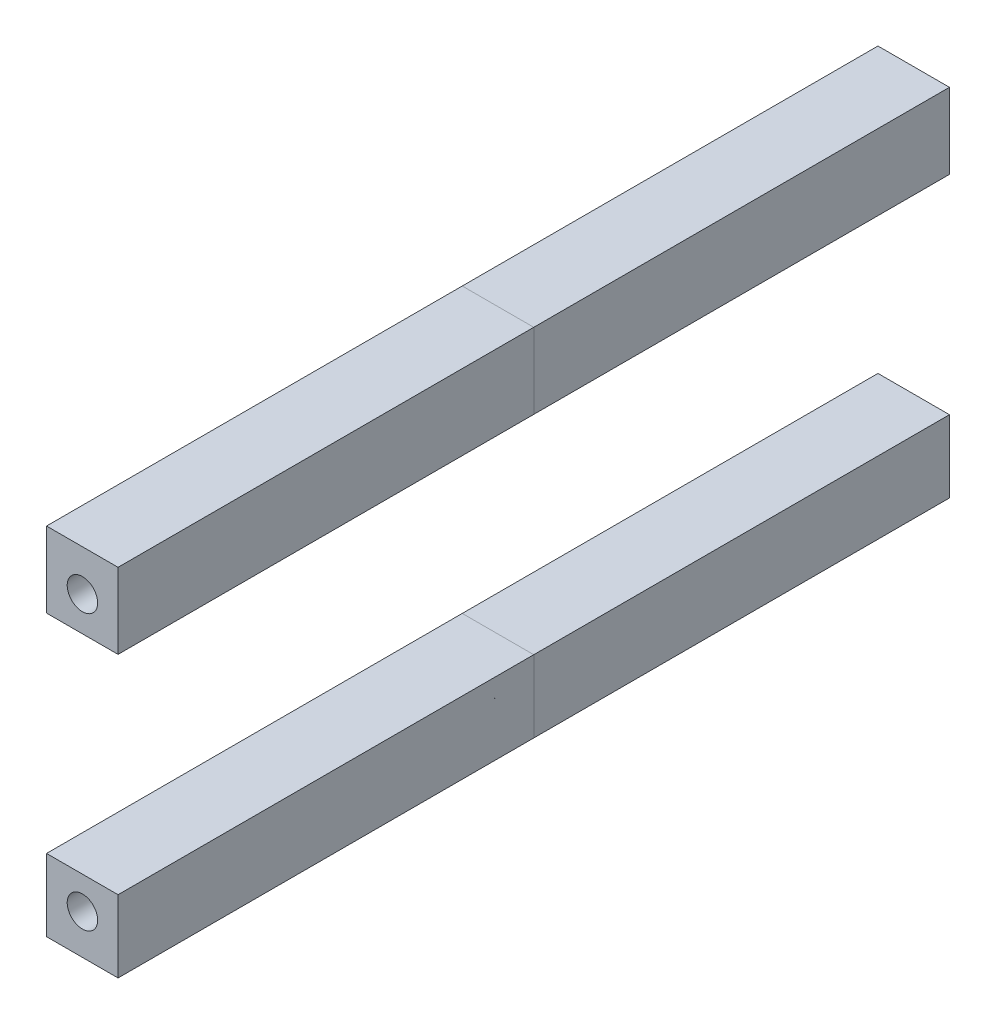
ISO-10303-21;
HEADER;
FILE_DESCRIPTION(('STEP AP214'),'2;1');
FILE_NAME('part.step','',(''),(''),'','','');
FILE_SCHEMA(('AUTOMOTIVE_DESIGN { 1 0 10303 214 1 1 1 1 }'));
ENDSEC;
DATA;
#1=APPLICATION_CONTEXT('core data for automotive mechanical design processes');
#2=APPLICATION_PROTOCOL_DEFINITION('international standard','automotive_design',2000,#1);
#3=PRODUCT_CONTEXT('',#1,'mechanical');
#4=PRODUCT('Part','Part','',(#3));
#5=PRODUCT_RELATED_PRODUCT_CATEGORY('part','',(#4));
#6=PRODUCT_DEFINITION_FORMATION('','',#4);
#7=PRODUCT_DEFINITION_CONTEXT('part definition',#1,'design');
#8=PRODUCT_DEFINITION('design','',#6,#7);
#9=PRODUCT_DEFINITION_SHAPE('','',#8);
#10=(LENGTH_UNIT() NAMED_UNIT(*) SI_UNIT(.MILLI.,.METRE.));
#11=(NAMED_UNIT(*) PLANE_ANGLE_UNIT() SI_UNIT($,.RADIAN.));
#12=(NAMED_UNIT(*) SI_UNIT($,.STERADIAN.) SOLID_ANGLE_UNIT());
#13=UNCERTAINTY_MEASURE_WITH_UNIT(LENGTH_MEASURE(1.E-05),#10,'distance_accuracy_value','');
#14=(GEOMETRIC_REPRESENTATION_CONTEXT(3) GLOBAL_UNCERTAINTY_ASSIGNED_CONTEXT((#13)) GLOBAL_UNIT_ASSIGNED_CONTEXT((#10,
#11,#12)) REPRESENTATION_CONTEXT('',''));
#15=CARTESIAN_POINT('',(0.,0.,0.));
#16=DIRECTION('',(0.,0.,1.));
#17=DIRECTION('',(1.,0.,0.));
#18=AXIS2_PLACEMENT_3D('',#15,#16,#17);
#19=CARTESIAN_POINT('',(26.6682742565804,-13.334,-110.236));
#20=DIRECTION('',(0.,1.,0.));
#21=DIRECTION('',(0.,0.,-1.));
#22=AXIS2_PLACEMENT_3D('',#19,#20,#21);
#23=PLANE('',#22);
#24=DIRECTION('',(0.,0.,1.));
#25=VECTOR('',#24,1.);
#26=CARTESIAN_POINT('',(39.9346416559342,-13.334,-157.988));
#27=LINE('',#26,#25);
#28=CARTESIAN_POINT('',(39.9346416559342,-13.334,-122.936));
#29=VERTEX_POINT('',#28);
#30=CARTESIAN_POINT('',(39.9346416559342,-13.334,-61.468));
#31=VERTEX_POINT('',#30);
#32=EDGE_CURVE('E52',#29,#31,#27,.T.);
#33=ORIENTED_EDGE('',*,*,#32,.F.);
#34=DIRECTION('',(-1.,0.,0.));
#35=VECTOR('',#34,1.);
#36=CARTESIAN_POINT('',(26.6682742565804,-13.334,-122.936));
#37=LINE('',#36,#35);
#38=CARTESIAN_POINT('',(29.3613265236635,-13.334,-122.936));
#39=VERTEX_POINT('',#38);
#40=EDGE_CURVE('E109',#29,#39,#37,.T.);
#41=ORIENTED_EDGE('',*,*,#40,.T.);
#42=DIRECTION('',(0.,0.,1.));
#43=VECTOR('',#42,1.);
#44=CARTESIAN_POINT('',(29.3613265236635,-13.334,-122.936));
#45=LINE('',#44,#43);
#46=CARTESIAN_POINT('',(29.3613265236635,-13.334,-61.468));
#47=VERTEX_POINT('',#46);
#48=EDGE_CURVE('E102',#39,#47,#45,.T.);
#49=ORIENTED_EDGE('',*,*,#48,.T.);
#50=DIRECTION('',(1.,0.,0.));
#51=VECTOR('',#50,1.);
#52=CARTESIAN_POINT('',(39.9346416559342,-13.334,-61.468));
#53=LINE('',#52,#51);
#54=EDGE_CURVE('E91',#47,#31,#53,.T.);
#55=ORIENTED_EDGE('',*,*,#54,.T.);
#56=EDGE_LOOP('',(#33,#41,#49,#55));
#57=FACE_BOUND('',#56,.T.);
#58=ADVANCED_FACE('F48',(#57),#23,.T.);
#59=CARTESIAN_POINT('',(0.,0.,-122.936));
#60=DIRECTION('',(0.,0.,-1.));
#61=DIRECTION('',(1.,0.,0.));
#62=AXIS2_PLACEMENT_3D('',#59,#60,#61);
#63=PLANE('',#62);
#64=DIRECTION('',(0.,-1.,0.));
#65=VECTOR('',#64,1.);
#66=CARTESIAN_POINT('',(39.9346416559342,0.,-122.936));
#67=LINE('',#66,#65);
#68=CARTESIAN_POINT('',(39.9346416559342,-24.4883017461568,-122.936));
#69=VERTEX_POINT('',#68);
#70=EDGE_CURVE('E103',#29,#69,#67,.T.);
#71=ORIENTED_EDGE('',*,*,#70,.T.);
#72=DIRECTION('',(-1.,0.,0.));
#73=VECTOR('',#72,1.);
#74=CARTESIAN_POINT('',(0.,-24.4883017461568,-122.936));
#75=LINE('',#74,#73);
#76=CARTESIAN_POINT('',(29.3613265236635,-24.4883017461568,-122.936));
#77=VERTEX_POINT('',#76);
#78=EDGE_CURVE('E58',#69,#77,#75,.T.);
#79=ORIENTED_EDGE('',*,*,#78,.T.);
#80=DIRECTION('',(0.,1.,0.));
#81=VECTOR('',#80,1.);
#82=CARTESIAN_POINT('',(29.3613265236635,0.,-122.936));
#83=LINE('',#82,#81);
#84=EDGE_CURVE('E12',#77,#39,#83,.T.);
#85=ORIENTED_EDGE('',*,*,#84,.T.);
#86=ORIENTED_EDGE('',*,*,#40,.F.);
#87=EDGE_LOOP('',(#71,#79,#85,#86));
#88=FACE_BOUND('',#87,.T.);
#89=CARTESIAN_POINT('',(34.6682742565804,-19.4034898588683,-122.936));
#90=DIRECTION('',(0.,0.,1.));
#91=DIRECTION('',(1.,0.,0.));
#92=AXIS2_PLACEMENT_3D('',#89,#90,#91);
#93=CIRCLE('',#92,2.24999999999999);
#94=CARTESIAN_POINT('',(36.9182742565804,-19.4034898588683,-122.936));
#95=VERTEX_POINT('',#94);
#96=EDGE_CURVE('E110',#95,#95,#93,.T.);
#97=ORIENTED_EDGE('',*,*,#96,.T.);
#98=EDGE_LOOP('',(#97));
#99=FACE_BOUND('',#98,.T.);
#100=ADVANCED_FACE('F50',(#88,#99),#63,.T.);
#101=CARTESIAN_POINT('',(34.6682742565804,-19.4034898588683,-110.236));
#102=DIRECTION('',(0.,0.,-1.));
#103=DIRECTION('',(1.,0.,0.));
#104=AXIS2_PLACEMENT_3D('',#101,#102,#103);
#105=CYLINDRICAL_SURFACE('',#104,2.24999999999999);
#106=ORIENTED_EDGE('',*,*,#96,.F.);
#107=EDGE_LOOP('',(#106));
#108=FACE_BOUND('',#107,.T.);
#109=CARTESIAN_POINT('',(34.6682742565804,-19.4034898588683,-61.468));
#110=DIRECTION('',(0.,0.,-1.));
#111=DIRECTION('',(-1.,0.,0.));
#112=AXIS2_PLACEMENT_3D('',#109,#110,#111);
#113=CIRCLE('',#112,2.24999999999999);
#114=CARTESIAN_POINT('',(32.4182742565804,-19.4034898588683,-61.468));
#115=VERTEX_POINT('',#114);
#116=EDGE_CURVE('E113',#115,#115,#113,.T.);
#117=ORIENTED_EDGE('',*,*,#116,.F.);
#118=EDGE_LOOP('',(#117));
#119=FACE_BOUND('',#118,.T.);
#120=ADVANCED_FACE('F126',(#108,#119),#105,.F.);
#121=CARTESIAN_POINT('',(39.9346416559342,-13.334,-122.936));
#122=DIRECTION('',(1.,0.,0.));
#123=DIRECTION('',(0.,0.,1.));
#124=AXIS2_PLACEMENT_3D('',#121,#122,#123);
#125=PLANE('',#124);
#126=DIRECTION('',(0.,-1.,0.));
#127=VECTOR('',#126,1.);
#128=CARTESIAN_POINT('',(39.9346416559342,-13.334,-61.468));
#129=LINE('',#128,#127);
#130=CARTESIAN_POINT('',(39.9346416559342,-24.4883017461568,-61.468));
#131=VERTEX_POINT('',#130);
#132=EDGE_CURVE('E86',#31,#131,#129,.T.);
#133=ORIENTED_EDGE('',*,*,#132,.T.);
#134=DIRECTION('',(0.,0.,1.));
#135=VECTOR('',#134,1.);
#136=CARTESIAN_POINT('',(39.9346416559342,-24.4883017461568,-122.936));
#137=LINE('',#136,#135);
#138=EDGE_CURVE('E117',#69,#131,#137,.T.);
#139=ORIENTED_EDGE('',*,*,#138,.F.);
#140=ORIENTED_EDGE('',*,*,#70,.F.);
#141=ORIENTED_EDGE('',*,*,#32,.T.);
#142=EDGE_LOOP('',(#133,#139,#140,#141));
#143=FACE_BOUND('',#142,.T.);
#144=ADVANCED_FACE('F107',(#143),#125,.T.);
#145=CARTESIAN_POINT('',(29.3613265236635,-13.334,-122.936));
#146=DIRECTION('',(-1.,0.,0.));
#147=DIRECTION('',(0.,0.,-1.));
#148=AXIS2_PLACEMENT_3D('',#145,#146,#147);
#149=PLANE('',#148);
#150=DIRECTION('',(0.,0.,1.));
#151=VECTOR('',#150,1.);
#152=CARTESIAN_POINT('',(29.3613265236635,-24.4883017461568,-122.936));
#153=LINE('',#152,#151);
#154=CARTESIAN_POINT('',(29.3613265236635,-24.4883017461568,-61.468));
#155=VERTEX_POINT('',#154);
#156=EDGE_CURVE('E97',#77,#155,#153,.T.);
#157=ORIENTED_EDGE('',*,*,#156,.T.);
#158=DIRECTION('',(0.,1.,0.));
#159=VECTOR('',#158,1.);
#160=CARTESIAN_POINT('',(29.3613265236635,-13.334,-61.468));
#161=LINE('',#160,#159);
#162=EDGE_CURVE('E104',#155,#47,#161,.T.);
#163=ORIENTED_EDGE('',*,*,#162,.T.);
#164=ORIENTED_EDGE('',*,*,#48,.F.);
#165=ORIENTED_EDGE('',*,*,#84,.F.);
#166=EDGE_LOOP('',(#157,#163,#164,#165));
#167=FACE_BOUND('',#166,.T.);
#168=ADVANCED_FACE('F134',(#167),#149,.T.);
#169=CARTESIAN_POINT('',(39.9346416559342,-24.4883017461568,-122.936));
#170=DIRECTION('',(0.,-1.,0.));
#171=DIRECTION('',(0.,0.,1.));
#172=AXIS2_PLACEMENT_3D('',#169,#170,#171);
#173=PLANE('',#172);
#174=ORIENTED_EDGE('',*,*,#138,.T.);
#175=DIRECTION('',(-1.,0.,0.));
#176=VECTOR('',#175,1.);
#177=CARTESIAN_POINT('',(39.9346416559342,-24.4883017461568,-61.468));
#178=LINE('',#177,#176);
#179=EDGE_CURVE('E93',#131,#155,#178,.T.);
#180=ORIENTED_EDGE('',*,*,#179,.T.);
#181=ORIENTED_EDGE('',*,*,#156,.F.);
#182=ORIENTED_EDGE('',*,*,#78,.F.);
#183=EDGE_LOOP('',(#174,#180,#181,#182));
#184=FACE_BOUND('',#183,.T.);
#185=ADVANCED_FACE('F167',(#184),#173,.T.);
#186=CARTESIAN_POINT('',(0.,0.,-61.468));
#187=DIRECTION('',(0.,0.,1.));
#188=DIRECTION('',(-1.,0.,0.));
#189=AXIS2_PLACEMENT_3D('',#186,#187,#188);
#190=PLANE('',#189);
#191=ORIENTED_EDGE('',*,*,#132,.F.);
#192=ORIENTED_EDGE('',*,*,#54,.F.);
#193=ORIENTED_EDGE('',*,*,#162,.F.);
#194=ORIENTED_EDGE('',*,*,#179,.F.);
#195=EDGE_LOOP('',(#191,#192,#193,#194));
#196=FACE_BOUND('',#195,.T.);
#197=ORIENTED_EDGE('',*,*,#116,.T.);
#198=EDGE_LOOP('',(#197));
#199=FACE_BOUND('',#198,.T.);
#200=ADVANCED_FACE('F88',(#196,#199),#190,.T.);
#201=CLOSED_SHELL('',(#58,#100,#120,#144,#168,#185,#200));
#202=MANIFOLD_SOLID_BREP('B2',#201);
#203=CARTESIAN_POINT('',(0.,0.,-61.468));
#204=DIRECTION('',(0.,0.,-1.));
#205=DIRECTION('',(1.,0.,0.));
#206=AXIS2_PLACEMENT_3D('',#203,#204,#205);
#207=PLANE('',#206);
#208=DIRECTION('',(0.,-1.,0.));
#209=VECTOR('',#208,1.);
#210=CARTESIAN_POINT('',(39.9346416559342,-65.926275723454,-61.468));
#211=LINE('',#210,#209);
#212=CARTESIAN_POINT('',(39.9346416559342,-55.2598376185571,-61.468));
#213=VERTEX_POINT('',#212);
#214=CARTESIAN_POINT('',(39.9346416559342,-65.926275723454,-61.468));
#215=VERTEX_POINT('',#214);
#216=EDGE_CURVE('E272',#213,#215,#211,.T.);
#217=ORIENTED_EDGE('',*,*,#216,.F.);
#218=DIRECTION('',(1.,0.,0.));
#219=VECTOR('',#218,1.);
#220=CARTESIAN_POINT('',(39.9346416559342,-55.2598376185571,-61.468));
#221=LINE('',#220,#219);
#222=CARTESIAN_POINT('',(29.3613265236635,-55.2598376185571,-61.468));
#223=VERTEX_POINT('',#222);
#224=EDGE_CURVE('E273',#223,#213,#221,.T.);
#225=ORIENTED_EDGE('',*,*,#224,.F.);
#226=DIRECTION('',(0.,1.,0.));
#227=VECTOR('',#226,1.);
#228=CARTESIAN_POINT('',(29.3613265236635,-65.926275723454,-61.468));
#229=LINE('',#228,#227);
#230=CARTESIAN_POINT('',(29.3613265236635,-65.926275723454,-61.468));
#231=VERTEX_POINT('',#230);
#232=EDGE_CURVE('E277',#231,#223,#229,.T.);
#233=ORIENTED_EDGE('',*,*,#232,.F.);
#234=DIRECTION('',(-1.,0.,0.));
#235=VECTOR('',#234,1.);
#236=CARTESIAN_POINT('',(39.9346416559342,-65.926275723454,-61.468));
#237=LINE('',#236,#235);
#238=EDGE_CURVE('E292',#215,#231,#237,.T.);
#239=ORIENTED_EDGE('',*,*,#238,.F.);
#240=EDGE_LOOP('',(#217,#225,#233,#239));
#241=FACE_BOUND('',#240,.T.);
#242=CARTESIAN_POINT('',(34.6682742565804,-60.0434898588683,-61.468));
#243=DIRECTION('',(0.,0.,-1.));
#244=DIRECTION('',(-1.,0.,0.));
#245=AXIS2_PLACEMENT_3D('',#242,#243,#244);
#246=CIRCLE('',#245,2.24999999999999);
#247=CARTESIAN_POINT('',(32.4182742565804,-60.0434898588683,-61.468));
#248=VERTEX_POINT('',#247);
#249=EDGE_CURVE('E295',#248,#248,#246,.T.);
#250=ORIENTED_EDGE('',*,*,#249,.T.);
#251=EDGE_LOOP('',(#250));
#252=FACE_BOUND('',#251,.T.);
#253=ADVANCED_FACE('F218',(#241,#252),#207,.F.);
#254=CARTESIAN_POINT('',(39.9346416559342,-65.926275723454,-122.936));
#255=DIRECTION('',(0.,-1.,0.));
#256=DIRECTION('',(0.,0.,1.));
#257=AXIS2_PLACEMENT_3D('',#254,#255,#256);
#258=PLANE('',#257);
#259=DIRECTION('',(0.,0.,1.));
#260=VECTOR('',#259,1.);
#261=CARTESIAN_POINT('',(39.9346416559342,-65.926275723454,-122.936));
#262=LINE('',#261,#260);
#263=CARTESIAN_POINT('',(39.9346416559342,-65.926275723454,-122.936));
#264=VERTEX_POINT('',#263);
#265=EDGE_CURVE('E266',#264,#215,#262,.T.);
#266=ORIENTED_EDGE('',*,*,#265,.T.);
#267=ORIENTED_EDGE('',*,*,#238,.T.);
#268=DIRECTION('',(0.,0.,1.));
#269=VECTOR('',#268,1.);
#270=CARTESIAN_POINT('',(29.3613265236635,-65.926275723454,-122.936));
#271=LINE('',#270,#269);
#272=CARTESIAN_POINT('',(29.3613265236635,-65.926275723454,-122.936));
#273=VERTEX_POINT('',#272);
#274=EDGE_CURVE('E268',#273,#231,#271,.T.);
#275=ORIENTED_EDGE('',*,*,#274,.F.);
#276=DIRECTION('',(1.,0.,0.));
#277=VECTOR('',#276,1.);
#278=CARTESIAN_POINT('',(0.,-65.926275723454,-122.936));
#279=LINE('',#278,#277);
#280=EDGE_CURVE('E259',#273,#264,#279,.T.);
#281=ORIENTED_EDGE('',*,*,#280,.T.);
#282=EDGE_LOOP('',(#266,#267,#275,#281));
#283=FACE_BOUND('',#282,.T.);
#284=ADVANCED_FACE('F264',(#283),#258,.T.);
#285=CARTESIAN_POINT('',(29.3613265236635,-65.926275723454,-122.936));
#286=DIRECTION('',(-1.,0.,0.));
#287=DIRECTION('',(0.,0.,-1.));
#288=AXIS2_PLACEMENT_3D('',#285,#286,#287);
#289=PLANE('',#288);
#290=ORIENTED_EDGE('',*,*,#274,.T.);
#291=ORIENTED_EDGE('',*,*,#232,.T.);
#292=DIRECTION('',(0.,0.,1.));
#293=VECTOR('',#292,1.);
#294=CARTESIAN_POINT('',(29.3613265236635,-55.2598376185571,-122.936));
#295=LINE('',#294,#293);
#296=CARTESIAN_POINT('',(29.3613265236635,-55.2598376185571,-122.936));
#297=VERTEX_POINT('',#296);
#298=EDGE_CURVE('E275',#297,#223,#295,.T.);
#299=ORIENTED_EDGE('',*,*,#298,.F.);
#300=DIRECTION('',(0.,-1.,0.));
#301=VECTOR('',#300,1.);
#302=CARTESIAN_POINT('',(29.3613265236635,0.,-122.936));
#303=LINE('',#302,#301);
#304=EDGE_CURVE('E226',#297,#273,#303,.T.);
#305=ORIENTED_EDGE('',*,*,#304,.T.);
#306=EDGE_LOOP('',(#290,#291,#299,#305));
#307=FACE_BOUND('',#306,.T.);
#308=ADVANCED_FACE('F284',(#307),#289,.T.);
#309=CARTESIAN_POINT('',(39.9346416559342,-55.2598376185571,-122.936));
#310=DIRECTION('',(0.,1.,0.));
#311=DIRECTION('',(0.,0.,-1.));
#312=AXIS2_PLACEMENT_3D('',#309,#310,#311);
#313=PLANE('',#312);
#314=ORIENTED_EDGE('',*,*,#298,.T.);
#315=ORIENTED_EDGE('',*,*,#224,.T.);
#316=DIRECTION('',(0.,0.,1.));
#317=VECTOR('',#316,1.);
#318=CARTESIAN_POINT('',(39.9346416559342,-55.2598376185571,-122.936));
#319=LINE('',#318,#317);
#320=CARTESIAN_POINT('',(39.9346416559342,-55.2598376185571,-122.936));
#321=VERTEX_POINT('',#320);
#322=EDGE_CURVE('E238',#321,#213,#319,.T.);
#323=ORIENTED_EDGE('',*,*,#322,.F.);
#324=DIRECTION('',(-1.,0.,0.));
#325=VECTOR('',#324,1.);
#326=CARTESIAN_POINT('',(0.,-55.2598376185571,-122.936));
#327=LINE('',#326,#325);
#328=EDGE_CURVE('E46',#321,#297,#327,.T.);
#329=ORIENTED_EDGE('',*,*,#328,.T.);
#330=EDGE_LOOP('',(#314,#315,#323,#329));
#331=FACE_BOUND('',#330,.T.);
#332=ADVANCED_FACE('F308',(#331),#313,.T.);
#333=CARTESIAN_POINT('',(39.9346416559342,-65.926275723454,-122.936));
#334=DIRECTION('',(1.,0.,0.));
#335=DIRECTION('',(0.,0.,1.));
#336=AXIS2_PLACEMENT_3D('',#333,#334,#335);
#337=PLANE('',#336);
#338=ORIENTED_EDGE('',*,*,#322,.T.);
#339=ORIENTED_EDGE('',*,*,#216,.T.);
#340=ORIENTED_EDGE('',*,*,#265,.F.);
#341=DIRECTION('',(0.,1.,0.));
#342=VECTOR('',#341,1.);
#343=CARTESIAN_POINT('',(39.9346416559342,0.,-122.936));
#344=LINE('',#343,#342);
#345=EDGE_CURVE('E233',#264,#321,#344,.T.);
#346=ORIENTED_EDGE('',*,*,#345,.T.);
#347=EDGE_LOOP('',(#338,#339,#340,#346));
#348=FACE_BOUND('',#347,.T.);
#349=ADVANCED_FACE('F270',(#348),#337,.T.);
#350=CARTESIAN_POINT('',(34.6682742565804,-60.0434898588683,-110.236));
#351=DIRECTION('',(0.,0.,-1.));
#352=DIRECTION('',(1.,0.,0.));
#353=AXIS2_PLACEMENT_3D('',#350,#351,#352);
#354=CYLINDRICAL_SURFACE('',#353,2.24999999999999);
#355=CARTESIAN_POINT('',(34.6682742565804,-60.0434898588683,-122.936));
#356=DIRECTION('',(0.,0.,1.));
#357=DIRECTION('',(1.,0.,0.));
#358=AXIS2_PLACEMENT_3D('',#355,#356,#357);
#359=CIRCLE('',#358,2.24999999999999);
#360=CARTESIAN_POINT('',(36.9182742565804,-60.0434898588683,-122.936));
#361=VERTEX_POINT('',#360);
#362=EDGE_CURVE('E261',#361,#361,#359,.T.);
#363=ORIENTED_EDGE('',*,*,#362,.F.);
#364=EDGE_LOOP('',(#363));
#365=FACE_BOUND('',#364,.T.);
#366=ORIENTED_EDGE('',*,*,#249,.F.);
#367=EDGE_LOOP('',(#366));
#368=FACE_BOUND('',#367,.T.);
#369=ADVANCED_FACE('F300',(#365,#368),#354,.F.);
#370=CARTESIAN_POINT('',(0.,0.,-122.936));
#371=DIRECTION('',(0.,0.,-1.));
#372=DIRECTION('',(1.,0.,0.));
#373=AXIS2_PLACEMENT_3D('',#370,#371,#372);
#374=PLANE('',#373);
#375=ORIENTED_EDGE('',*,*,#362,.T.);
#376=EDGE_LOOP('',(#375));
#377=FACE_BOUND('',#376,.T.);
#378=ORIENTED_EDGE('',*,*,#345,.F.);
#379=ORIENTED_EDGE('',*,*,#280,.F.);
#380=ORIENTED_EDGE('',*,*,#304,.F.);
#381=ORIENTED_EDGE('',*,*,#328,.F.);
#382=EDGE_LOOP('',(#378,#379,#380,#381));
#383=FACE_BOUND('',#382,.T.);
#384=ADVANCED_FACE('F220',(#377,#383),#374,.T.);
#385=CLOSED_SHELL('',(#253,#284,#308,#332,#349,#369,#384));
#386=MANIFOLD_SOLID_BREP('B6',#385);
#387=CARTESIAN_POINT('',(26.6682742565804,-13.334,-12.7));
#388=DIRECTION('',(0.,1.,0.));
#389=DIRECTION('',(0.,0.,1.));
#390=AXIS2_PLACEMENT_3D('',#387,#388,#389);
#391=PLANE('',#390);
#392=DIRECTION('',(0.,0.,-1.));
#393=VECTOR('',#392,1.);
#394=CARTESIAN_POINT('',(39.9346416559342,-13.334,35.052));
#395=LINE('',#394,#393);
#396=CARTESIAN_POINT('',(39.9346416559342,-13.334,0.));
#397=VERTEX_POINT('',#396);
#398=CARTESIAN_POINT('',(39.9346416559342,-13.334,-61.468));
#399=VERTEX_POINT('',#398);
#400=EDGE_CURVE('E391',#397,#399,#395,.T.);
#401=ORIENTED_EDGE('',*,*,#400,.T.);
#402=DIRECTION('',(1.,0.,0.));
#403=VECTOR('',#402,1.);
#404=CARTESIAN_POINT('',(39.9346416559342,-13.334,-61.468));
#405=LINE('',#404,#403);
#406=CARTESIAN_POINT('',(29.3613265236635,-13.334,-61.468));
#407=VERTEX_POINT('',#406);
#408=EDGE_CURVE('E424',#407,#399,#405,.T.);
#409=ORIENTED_EDGE('',*,*,#408,.F.);
#410=DIRECTION('',(0.,0.,-1.));
#411=VECTOR('',#410,1.);
#412=CARTESIAN_POINT('',(29.3613265236635,-13.334,0.));
#413=LINE('',#412,#411);
#414=CARTESIAN_POINT('',(29.3613265236635,-13.334,0.));
#415=VERTEX_POINT('',#414);
#416=EDGE_CURVE('E405',#415,#407,#413,.T.);
#417=ORIENTED_EDGE('',*,*,#416,.F.);
#418=DIRECTION('',(-1.,0.,0.));
#419=VECTOR('',#418,1.);
#420=CARTESIAN_POINT('',(26.6682742565804,-13.334,0.));
#421=LINE('',#420,#419);
#422=EDGE_CURVE('E426',#397,#415,#421,.T.);
#423=ORIENTED_EDGE('',*,*,#422,.F.);
#424=EDGE_LOOP('',(#401,#409,#417,#423));
#425=FACE_BOUND('',#424,.T.);
#426=ADVANCED_FACE('F387',(#425),#391,.T.);
#427=CARTESIAN_POINT('',(0.,0.,0.));
#428=DIRECTION('',(0.,0.,1.));
#429=DIRECTION('',(1.,0.,0.));
#430=AXIS2_PLACEMENT_3D('',#427,#428,#429);
#431=PLANE('',#430);
#432=DIRECTION('',(0.,-1.,0.));
#433=VECTOR('',#432,1.);
#434=CARTESIAN_POINT('',(39.9346416559342,0.,0.));
#435=LINE('',#434,#433);
#436=CARTESIAN_POINT('',(39.9346416559342,-24.4883017461568,0.));
#437=VERTEX_POINT('',#436);
#438=EDGE_CURVE('E440',#397,#437,#435,.T.);
#439=ORIENTED_EDGE('',*,*,#438,.F.);
#440=ORIENTED_EDGE('',*,*,#422,.T.);
#441=DIRECTION('',(0.,1.,0.));
#442=VECTOR('',#441,1.);
#443=CARTESIAN_POINT('',(29.3613265236635,0.,0.));
#444=LINE('',#443,#442);
#445=CARTESIAN_POINT('',(29.3613265236635,-24.4883017461568,0.));
#446=VERTEX_POINT('',#445);
#447=EDGE_CURVE('E216',#446,#415,#444,.T.);
#448=ORIENTED_EDGE('',*,*,#447,.F.);
#449=DIRECTION('',(-1.,0.,0.));
#450=VECTOR('',#449,1.);
#451=CARTESIAN_POINT('',(0.,-24.4883017461568,0.));
#452=LINE('',#451,#450);
#453=EDGE_CURVE('E397',#437,#446,#452,.T.);
#454=ORIENTED_EDGE('',*,*,#453,.F.);
#455=EDGE_LOOP('',(#439,#440,#448,#454));
#456=FACE_BOUND('',#455,.T.);
#457=CARTESIAN_POINT('',(34.6682742565804,-19.4034898588683,0.));
#458=DIRECTION('',(0.,0.,1.));
#459=DIRECTION('',(1.,0.,0.));
#460=AXIS2_PLACEMENT_3D('',#457,#458,#459);
#461=CIRCLE('',#460,2.24999999999999);
#462=CARTESIAN_POINT('',(36.9182742565804,-19.4034898588683,0.));
#463=VERTEX_POINT('',#462);
#464=EDGE_CURVE('E453',#463,#463,#461,.T.);
#465=ORIENTED_EDGE('',*,*,#464,.F.);
#466=EDGE_LOOP('',(#465));
#467=FACE_BOUND('',#466,.T.);
#468=ADVANCED_FACE('F389',(#456,#467),#431,.T.);
#469=CARTESIAN_POINT('',(34.6682742565804,-19.4034898588683,-12.7));
#470=DIRECTION('',(0.,0.,1.));
#471=DIRECTION('',(1.,0.,0.));
#472=AXIS2_PLACEMENT_3D('',#469,#470,#471);
#473=CYLINDRICAL_SURFACE('',#472,2.24999999999999);
#474=ORIENTED_EDGE('',*,*,#464,.T.);
#475=EDGE_LOOP('',(#474));
#476=FACE_BOUND('',#475,.T.);
#477=CARTESIAN_POINT('',(34.6682742565804,-19.4034898588683,-61.468));
#478=DIRECTION('',(0.,0.,-1.));
#479=DIRECTION('',(-1.,0.,0.));
#480=AXIS2_PLACEMENT_3D('',#477,#478,#479);
#481=CIRCLE('',#480,2.24999999999999);
#482=CARTESIAN_POINT('',(32.4182742565804,-19.4034898588683,-61.468));
#483=VERTEX_POINT('',#482);
#484=EDGE_CURVE('E451',#483,#483,#481,.T.);
#485=ORIENTED_EDGE('',*,*,#484,.T.);
#486=EDGE_LOOP('',(#485));
#487=FACE_BOUND('',#486,.T.);
#488=ADVANCED_FACE('F487',(#476,#487),#473,.F.);
#489=CARTESIAN_POINT('',(39.9346416559342,-13.334,0.));
#490=DIRECTION('',(1.,0.,0.));
#491=DIRECTION('',(0.,0.,-1.));
#492=AXIS2_PLACEMENT_3D('',#489,#490,#491);
#493=PLANE('',#492);
#494=DIRECTION('',(0.,-1.,0.));
#495=VECTOR('',#494,1.);
#496=CARTESIAN_POINT('',(39.9346416559342,-13.334,-61.468));
#497=LINE('',#496,#495);
#498=CARTESIAN_POINT('',(39.9346416559342,-24.4883017461568,-61.468));
#499=VERTEX_POINT('',#498);
#500=EDGE_CURVE('E437',#399,#499,#497,.T.);
#501=ORIENTED_EDGE('',*,*,#500,.F.);
#502=ORIENTED_EDGE('',*,*,#400,.F.);
#503=ORIENTED_EDGE('',*,*,#438,.T.);
#504=DIRECTION('',(0.,0.,-1.));
#505=VECTOR('',#504,1.);
#506=CARTESIAN_POINT('',(39.9346416559342,-24.4883017461568,0.));
#507=LINE('',#506,#505);
#508=EDGE_CURVE('E443',#437,#499,#507,.T.);
#509=ORIENTED_EDGE('',*,*,#508,.T.);
#510=EDGE_LOOP('',(#501,#502,#503,#509));
#511=FACE_BOUND('',#510,.T.);
#512=ADVANCED_FACE('F442',(#511),#493,.T.);
#513=CARTESIAN_POINT('',(29.3613265236635,-13.334,0.));
#514=DIRECTION('',(-1.,0.,0.));
#515=DIRECTION('',(0.,0.,1.));
#516=AXIS2_PLACEMENT_3D('',#513,#514,#515);
#517=PLANE('',#516);
#518=DIRECTION('',(0.,0.,-1.));
#519=VECTOR('',#518,1.);
#520=CARTESIAN_POINT('',(29.3613265236635,-24.4883017461568,0.));
#521=LINE('',#520,#519);
#522=CARTESIAN_POINT('',(29.3613265236635,-24.4883017461568,-61.468));
#523=VERTEX_POINT('',#522);
#524=EDGE_CURVE('E446',#446,#523,#521,.T.);
#525=ORIENTED_EDGE('',*,*,#524,.F.);
#526=ORIENTED_EDGE('',*,*,#447,.T.);
#527=ORIENTED_EDGE('',*,*,#416,.T.);
#528=DIRECTION('',(0.,1.,0.));
#529=VECTOR('',#528,1.);
#530=CARTESIAN_POINT('',(29.3613265236635,-13.334,-61.468));
#531=LINE('',#530,#529);
#532=EDGE_CURVE('E439',#523,#407,#531,.T.);
#533=ORIENTED_EDGE('',*,*,#532,.F.);
#534=EDGE_LOOP('',(#525,#526,#527,#533));
#535=FACE_BOUND('',#534,.T.);
#536=ADVANCED_FACE('F464',(#535),#517,.T.);
#537=CARTESIAN_POINT('',(39.9346416559342,-24.4883017461568,0.));
#538=DIRECTION('',(0.,-1.,0.));
#539=DIRECTION('',(0.,0.,-1.));
#540=AXIS2_PLACEMENT_3D('',#537,#538,#539);
#541=PLANE('',#540);
#542=ORIENTED_EDGE('',*,*,#508,.F.);
#543=ORIENTED_EDGE('',*,*,#453,.T.);
#544=ORIENTED_EDGE('',*,*,#524,.T.);
#545=DIRECTION('',(-1.,0.,0.));
#546=VECTOR('',#545,1.);
#547=CARTESIAN_POINT('',(39.9346416559342,-24.4883017461568,-61.468));
#548=LINE('',#547,#546);
#549=EDGE_CURVE('E445',#499,#523,#548,.T.);
#550=ORIENTED_EDGE('',*,*,#549,.F.);
#551=EDGE_LOOP('',(#542,#543,#544,#550));
#552=FACE_BOUND('',#551,.T.);
#553=ADVANCED_FACE('F473',(#552),#541,.T.);
#554=CARTESIAN_POINT('',(0.,0.,-61.468));
#555=DIRECTION('',(0.,0.,-1.));
#556=DIRECTION('',(-1.,0.,0.));
#557=AXIS2_PLACEMENT_3D('',#554,#555,#556);
#558=PLANE('',#557);
#559=ORIENTED_EDGE('',*,*,#500,.T.);
#560=ORIENTED_EDGE('',*,*,#549,.T.);
#561=ORIENTED_EDGE('',*,*,#532,.T.);
#562=ORIENTED_EDGE('',*,*,#408,.T.);
#563=EDGE_LOOP('',(#559,#560,#561,#562));
#564=FACE_BOUND('',#563,.T.);
#565=ORIENTED_EDGE('',*,*,#484,.F.);
#566=EDGE_LOOP('',(#565));
#567=FACE_BOUND('',#566,.T.);
#568=ADVANCED_FACE('F434',(#564,#567),#558,.T.);
#569=CLOSED_SHELL('',(#426,#468,#488,#512,#536,#553,#568));
#570=MANIFOLD_SOLID_BREP('B40',#569);
#571=CARTESIAN_POINT('',(0.,0.,-61.468));
#572=DIRECTION('',(0.,0.,1.));
#573=DIRECTION('',(1.,0.,0.));
#574=AXIS2_PLACEMENT_3D('',#571,#572,#573);
#575=PLANE('',#574);
#576=DIRECTION('',(0.,-1.,0.));
#577=VECTOR('',#576,1.);
#578=CARTESIAN_POINT('',(39.9346416559342,-65.926275723454,-61.468));
#579=LINE('',#578,#577);
#580=CARTESIAN_POINT('',(39.9346416559342,-55.2598376185571,-61.468));
#581=VERTEX_POINT('',#580);
#582=CARTESIAN_POINT('',(39.9346416559342,-65.926275723454,-61.468));
#583=VERTEX_POINT('',#582);
#584=EDGE_CURVE('E619',#581,#583,#579,.T.);
#585=ORIENTED_EDGE('',*,*,#584,.T.);
#586=DIRECTION('',(-1.,0.,0.));
#587=VECTOR('',#586,1.);
#588=CARTESIAN_POINT('',(39.9346416559342,-65.926275723454,-61.468));
#589=LINE('',#588,#587);
#590=CARTESIAN_POINT('',(29.3613265236635,-65.926275723454,-61.468));
#591=VERTEX_POINT('',#590);
#592=EDGE_CURVE('E594',#583,#591,#589,.T.);
#593=ORIENTED_EDGE('',*,*,#592,.T.);
#594=DIRECTION('',(0.,1.,0.));
#595=VECTOR('',#594,1.);
#596=CARTESIAN_POINT('',(29.3613265236635,-65.926275723454,-61.468));
#597=LINE('',#596,#595);
#598=CARTESIAN_POINT('',(29.3613265236635,-55.2598376185571,-61.468));
#599=VERTEX_POINT('',#598);
#600=EDGE_CURVE('E615',#591,#599,#597,.T.);
#601=ORIENTED_EDGE('',*,*,#600,.T.);
#602=DIRECTION('',(1.,0.,0.));
#603=VECTOR('',#602,1.);
#604=CARTESIAN_POINT('',(39.9346416559342,-55.2598376185571,-61.468));
#605=LINE('',#604,#603);
#606=EDGE_CURVE('E597',#599,#581,#605,.T.);
#607=ORIENTED_EDGE('',*,*,#606,.T.);
#608=EDGE_LOOP('',(#585,#593,#601,#607));
#609=FACE_BOUND('',#608,.T.);
#610=CARTESIAN_POINT('',(34.6682742565804,-60.0434898588683,-61.468));
#611=DIRECTION('',(0.,0.,-1.));
#612=DIRECTION('',(-1.,0.,0.));
#613=AXIS2_PLACEMENT_3D('',#610,#611,#612);
#614=CIRCLE('',#613,2.24999999999999);
#615=CARTESIAN_POINT('',(32.4182742565804,-60.0434898588683,-61.468));
#616=VERTEX_POINT('',#615);
#617=EDGE_CURVE('E621',#616,#616,#614,.T.);
#618=ORIENTED_EDGE('',*,*,#617,.F.);
#619=EDGE_LOOP('',(#618));
#620=FACE_BOUND('',#619,.T.);
#621=ADVANCED_FACE('F547',(#609,#620),#575,.F.);
#622=CARTESIAN_POINT('',(39.9346416559342,-65.926275723454,0.));
#623=DIRECTION('',(0.,-1.,0.));
#624=DIRECTION('',(0.,0.,-1.));
#625=AXIS2_PLACEMENT_3D('',#622,#623,#624);
#626=PLANE('',#625);
#627=DIRECTION('',(0.,0.,-1.));
#628=VECTOR('',#627,1.);
#629=CARTESIAN_POINT('',(39.9346416559342,-65.926275723454,0.));
#630=LINE('',#629,#628);
#631=CARTESIAN_POINT('',(39.9346416559342,-65.926275723454,0.));
#632=VERTEX_POINT('',#631);
#633=EDGE_CURVE('E588',#632,#583,#630,.T.);
#634=ORIENTED_EDGE('',*,*,#633,.F.);
#635=DIRECTION('',(1.,0.,0.));
#636=VECTOR('',#635,1.);
#637=CARTESIAN_POINT('',(0.,-65.926275723454,0.));
#638=LINE('',#637,#636);
#639=CARTESIAN_POINT('',(29.3613265236635,-65.926275723454,0.));
#640=VERTEX_POINT('',#639);
#641=EDGE_CURVE('E591',#640,#632,#638,.T.);
#642=ORIENTED_EDGE('',*,*,#641,.F.);
#643=DIRECTION('',(0.,0.,-1.));
#644=VECTOR('',#643,1.);
#645=CARTESIAN_POINT('',(29.3613265236635,-65.926275723454,0.));
#646=LINE('',#645,#644);
#647=EDGE_CURVE('E596',#640,#591,#646,.T.);
#648=ORIENTED_EDGE('',*,*,#647,.T.);
#649=ORIENTED_EDGE('',*,*,#592,.F.);
#650=EDGE_LOOP('',(#634,#642,#648,#649));
#651=FACE_BOUND('',#650,.T.);
#652=ADVANCED_FACE('F589',(#651),#626,.T.);
#653=CARTESIAN_POINT('',(29.3613265236635,-65.926275723454,0.));
#654=DIRECTION('',(-1.,0.,0.));
#655=DIRECTION('',(0.,0.,1.));
#656=AXIS2_PLACEMENT_3D('',#653,#654,#655);
#657=PLANE('',#656);
#658=ORIENTED_EDGE('',*,*,#647,.F.);
#659=DIRECTION('',(0.,-1.,0.));
#660=VECTOR('',#659,1.);
#661=CARTESIAN_POINT('',(29.3613265236635,0.,0.));
#662=LINE('',#661,#660);
#663=CARTESIAN_POINT('',(29.3613265236635,-55.2598376185571,0.));
#664=VERTEX_POINT('',#663);
#665=EDGE_CURVE('E555',#664,#640,#662,.T.);
#666=ORIENTED_EDGE('',*,*,#665,.F.);
#667=DIRECTION('',(0.,0.,-1.));
#668=VECTOR('',#667,1.);
#669=CARTESIAN_POINT('',(29.3613265236635,-55.2598376185571,0.));
#670=LINE('',#669,#668);
#671=EDGE_CURVE('E611',#664,#599,#670,.T.);
#672=ORIENTED_EDGE('',*,*,#671,.T.);
#673=ORIENTED_EDGE('',*,*,#600,.F.);
#674=EDGE_LOOP('',(#658,#666,#672,#673));
#675=FACE_BOUND('',#674,.T.);
#676=ADVANCED_FACE('F633',(#675),#657,.T.);
#677=CARTESIAN_POINT('',(39.9346416559342,-55.2598376185571,0.));
#678=DIRECTION('',(0.,1.,0.));
#679=DIRECTION('',(0.,0.,1.));
#680=AXIS2_PLACEMENT_3D('',#677,#678,#679);
#681=PLANE('',#680);
#682=ORIENTED_EDGE('',*,*,#671,.F.);
#683=DIRECTION('',(-1.,0.,0.));
#684=VECTOR('',#683,1.);
#685=CARTESIAN_POINT('',(0.,-55.2598376185571,0.));
#686=LINE('',#685,#684);
#687=CARTESIAN_POINT('',(39.9346416559342,-55.2598376185571,0.));
#688=VERTEX_POINT('',#687);
#689=EDGE_CURVE('E385',#688,#664,#686,.T.);
#690=ORIENTED_EDGE('',*,*,#689,.F.);
#691=DIRECTION('',(0.,0.,-1.));
#692=VECTOR('',#691,1.);
#693=CARTESIAN_POINT('',(39.9346416559342,-55.2598376185571,0.));
#694=LINE('',#693,#692);
#695=EDGE_CURVE('E562',#688,#581,#694,.T.);
#696=ORIENTED_EDGE('',*,*,#695,.T.);
#697=ORIENTED_EDGE('',*,*,#606,.F.);
#698=EDGE_LOOP('',(#682,#690,#696,#697));
#699=FACE_BOUND('',#698,.T.);
#700=ADVANCED_FACE('F636',(#699),#681,.T.);
#701=CARTESIAN_POINT('',(39.9346416559342,-65.926275723454,0.));
#702=DIRECTION('',(1.,0.,0.));
#703=DIRECTION('',(0.,0.,-1.));
#704=AXIS2_PLACEMENT_3D('',#701,#702,#703);
#705=PLANE('',#704);
#706=ORIENTED_EDGE('',*,*,#695,.F.);
#707=DIRECTION('',(0.,1.,0.));
#708=VECTOR('',#707,1.);
#709=CARTESIAN_POINT('',(39.9346416559342,0.,0.));
#710=LINE('',#709,#708);
#711=EDGE_CURVE('E600',#632,#688,#710,.T.);
#712=ORIENTED_EDGE('',*,*,#711,.F.);
#713=ORIENTED_EDGE('',*,*,#633,.T.);
#714=ORIENTED_EDGE('',*,*,#584,.F.);
#715=EDGE_LOOP('',(#706,#712,#713,#714));
#716=FACE_BOUND('',#715,.T.);
#717=ADVANCED_FACE('F601',(#716),#705,.T.);
#718=CARTESIAN_POINT('',(34.6682742565804,-60.0434898588683,-12.7));
#719=DIRECTION('',(0.,0.,1.));
#720=DIRECTION('',(1.,0.,0.));
#721=AXIS2_PLACEMENT_3D('',#718,#719,#720);
#722=CYLINDRICAL_SURFACE('',#721,2.24999999999999);
#723=CARTESIAN_POINT('',(34.6682742565804,-60.0434898588683,0.));
#724=DIRECTION('',(0.,0.,1.));
#725=DIRECTION('',(1.,0.,0.));
#726=AXIS2_PLACEMENT_3D('',#723,#724,#725);
#727=CIRCLE('',#726,2.24999999999999);
#728=CARTESIAN_POINT('',(36.9182742565804,-60.0434898588683,0.));
#729=VERTEX_POINT('',#728);
#730=EDGE_CURVE('E603',#729,#729,#727,.T.);
#731=ORIENTED_EDGE('',*,*,#730,.T.);
#732=EDGE_LOOP('',(#731));
#733=FACE_BOUND('',#732,.T.);
#734=ORIENTED_EDGE('',*,*,#617,.T.);
#735=EDGE_LOOP('',(#734));
#736=FACE_BOUND('',#735,.T.);
#737=ADVANCED_FACE('F625',(#733,#736),#722,.F.);
#738=CARTESIAN_POINT('',(0.,0.,0.));
#739=DIRECTION('',(0.,0.,1.));
#740=DIRECTION('',(1.,0.,0.));
#741=AXIS2_PLACEMENT_3D('',#738,#739,#740);
#742=PLANE('',#741);
#743=ORIENTED_EDGE('',*,*,#730,.F.);
#744=EDGE_LOOP('',(#743));
#745=FACE_BOUND('',#744,.T.);
#746=ORIENTED_EDGE('',*,*,#711,.T.);
#747=ORIENTED_EDGE('',*,*,#689,.T.);
#748=ORIENTED_EDGE('',*,*,#665,.T.);
#749=ORIENTED_EDGE('',*,*,#641,.T.);
#750=EDGE_LOOP('',(#746,#747,#748,#749));
#751=FACE_BOUND('',#750,.T.);
#752=ADVANCED_FACE('F549',(#745,#751),#742,.T.);
#753=CLOSED_SHELL('',(#621,#652,#676,#700,#717,#737,#752));
#754=MANIFOLD_SOLID_BREP('B210',#753);
#755=ADVANCED_BREP_SHAPE_REPRESENTATION('',(#18,#202,#386,#570,#754),#14);
#756=SHAPE_DEFINITION_REPRESENTATION(#9,#755);
ENDSEC;
END-ISO-10303-21;
